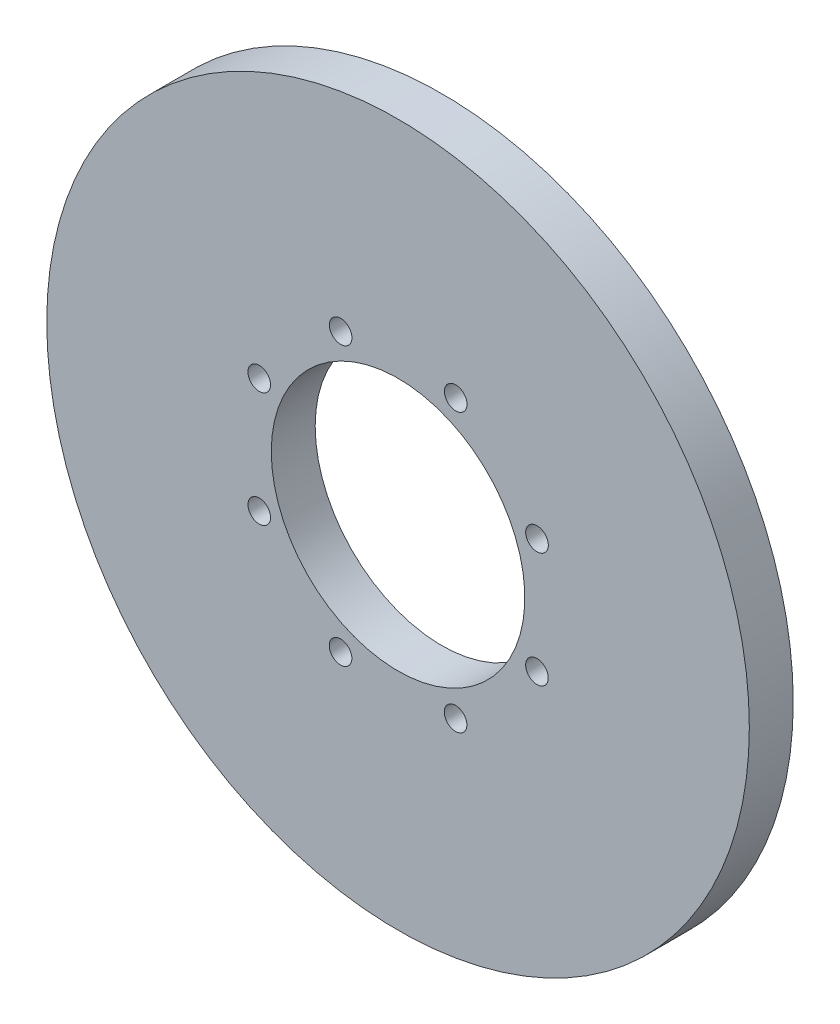
ISO-10303-21;
HEADER;
FILE_DESCRIPTION(('STEP AP214'),'2;1');
FILE_NAME('part.step','',(''),(''),'','','');
FILE_SCHEMA(('AUTOMOTIVE_DESIGN { 1 0 10303 214 1 1 1 1 }'));
ENDSEC;
DATA;
#1=APPLICATION_CONTEXT('core data for automotive mechanical design processes');
#2=APPLICATION_PROTOCOL_DEFINITION('international standard','automotive_design',2000,#1);
#3=PRODUCT_CONTEXT('',#1,'mechanical');
#4=PRODUCT('Part','Part','',(#3));
#5=PRODUCT_RELATED_PRODUCT_CATEGORY('part','',(#4));
#6=PRODUCT_DEFINITION_FORMATION('','',#4);
#7=PRODUCT_DEFINITION_CONTEXT('part definition',#1,'design');
#8=PRODUCT_DEFINITION('design','',#6,#7);
#9=PRODUCT_DEFINITION_SHAPE('','',#8);
#10=(LENGTH_UNIT() NAMED_UNIT(*) SI_UNIT(.MILLI.,.METRE.));
#11=(NAMED_UNIT(*) PLANE_ANGLE_UNIT() SI_UNIT($,.RADIAN.));
#12=(NAMED_UNIT(*) SI_UNIT($,.STERADIAN.) SOLID_ANGLE_UNIT());
#13=UNCERTAINTY_MEASURE_WITH_UNIT(LENGTH_MEASURE(1.E-05),#10,'distance_accuracy_value','');
#14=(GEOMETRIC_REPRESENTATION_CONTEXT(3) GLOBAL_UNCERTAINTY_ASSIGNED_CONTEXT((#13)) GLOBAL_UNIT_ASSIGNED_CONTEXT((#10,
#11,#12)) REPRESENTATION_CONTEXT('',''));
#15=CARTESIAN_POINT('',(0.,0.,0.));
#16=DIRECTION('',(0.,0.,1.));
#17=DIRECTION('',(1.,0.,0.));
#18=AXIS2_PLACEMENT_3D('',#15,#16,#17);
#19=CARTESIAN_POINT('',(0.,0.,19.05));
#20=DIRECTION('',(0.,0.,-1.));
#21=DIRECTION('',(-1.,0.,0.));
#22=AXIS2_PLACEMENT_3D('',#19,#20,#21);
#23=CYLINDRICAL_SURFACE('',#22,152.4);
#24=CARTESIAN_POINT('',(0.,0.,19.05));
#25=DIRECTION('',(0.,0.,1.));
#26=DIRECTION('',(1.,0.,0.));
#27=AXIS2_PLACEMENT_3D('',#24,#25,#26);
#28=CIRCLE('',#27,152.4);
#29=CARTESIAN_POINT('',(-152.4,0.,19.05));
#30=VERTEX_POINT('',#29);
#31=EDGE_CURVE('E10',#30,#30,#28,.T.);
#32=CARTESIAN_POINT('',(0.,0.,0.));
#33=DIRECTION('',(0.,0.,1.));
#34=DIRECTION('',(1.,0.,0.));
#35=AXIS2_PLACEMENT_3D('',#32,#33,#34);
#36=CIRCLE('',#35,152.4);
#37=CARTESIAN_POINT('',(-152.4,0.,0.));
#38=VERTEX_POINT('',#37);
#39=EDGE_CURVE('E34',#38,#38,#36,.T.);
#40=CARTESIAN_POINT('',(-152.4,0.,19.05));
#41=CARTESIAN_POINT('',(-152.4,0.,18.8515625));
#42=CARTESIAN_POINT('',(-152.4,0.,18.653125));
#43=CARTESIAN_POINT('',(-152.4,0.,18.25625));
#44=CARTESIAN_POINT('',(-152.4,0.,18.0578125));
#45=CARTESIAN_POINT('',(-152.4,0.,17.6609375));
#46=CARTESIAN_POINT('',(-152.4,0.,17.4625));
#47=CARTESIAN_POINT('',(-152.4,0.,17.065625));
#48=CARTESIAN_POINT('',(-152.4,0.,16.8671875));
#49=CARTESIAN_POINT('',(-152.4,0.,16.4703125));
#50=CARTESIAN_POINT('',(-152.4,0.,16.271875));
#51=CARTESIAN_POINT('',(-152.4,0.,15.875));
#52=CARTESIAN_POINT('',(-152.4,0.,15.6765625));
#53=CARTESIAN_POINT('',(-152.4,0.,15.2796875));
#54=CARTESIAN_POINT('',(-152.4,0.,15.08125));
#55=CARTESIAN_POINT('',(-152.4,0.,14.684375));
#56=CARTESIAN_POINT('',(-152.4,0.,14.4859375));
#57=CARTESIAN_POINT('',(-152.4,0.,14.0890625));
#58=CARTESIAN_POINT('',(-152.4,0.,13.890625));
#59=CARTESIAN_POINT('',(-152.4,0.,13.49375));
#60=CARTESIAN_POINT('',(-152.4,0.,13.2953125));
#61=CARTESIAN_POINT('',(-152.4,0.,12.8984375));
#62=CARTESIAN_POINT('',(-152.4,0.,12.7));
#63=CARTESIAN_POINT('',(-152.4,0.,12.303125));
#64=CARTESIAN_POINT('',(-152.4,0.,12.1046875));
#65=CARTESIAN_POINT('',(-152.4,0.,11.7078125));
#66=CARTESIAN_POINT('',(-152.4,0.,11.509375));
#67=CARTESIAN_POINT('',(-152.4,0.,11.1125));
#68=CARTESIAN_POINT('',(-152.4,0.,10.9140625));
#69=CARTESIAN_POINT('',(-152.4,0.,10.5171875));
#70=CARTESIAN_POINT('',(-152.4,0.,10.31875));
#71=CARTESIAN_POINT('',(-152.4,0.,9.921875));
#72=CARTESIAN_POINT('',(-152.4,0.,9.7234375));
#73=CARTESIAN_POINT('',(-152.4,0.,9.3265625));
#74=CARTESIAN_POINT('',(-152.4,0.,9.128125));
#75=CARTESIAN_POINT('',(-152.4,0.,8.73125));
#76=CARTESIAN_POINT('',(-152.4,0.,8.5328125));
#77=CARTESIAN_POINT('',(-152.4,0.,8.1359375));
#78=CARTESIAN_POINT('',(-152.4,0.,7.9375));
#79=CARTESIAN_POINT('',(-152.4,0.,7.540625));
#80=CARTESIAN_POINT('',(-152.4,0.,7.3421875));
#81=CARTESIAN_POINT('',(-152.4,0.,6.9453125));
#82=CARTESIAN_POINT('',(-152.4,0.,6.746875));
#83=CARTESIAN_POINT('',(-152.4,0.,6.35));
#84=CARTESIAN_POINT('',(-152.4,0.,6.1515625));
#85=CARTESIAN_POINT('',(-152.4,0.,5.7546875));
#86=CARTESIAN_POINT('',(-152.4,0.,5.55625));
#87=CARTESIAN_POINT('',(-152.4,0.,5.159375));
#88=CARTESIAN_POINT('',(-152.4,0.,4.9609375));
#89=CARTESIAN_POINT('',(-152.4,0.,4.5640625));
#90=CARTESIAN_POINT('',(-152.4,0.,4.365625));
#91=CARTESIAN_POINT('',(-152.4,0.,3.96875));
#92=CARTESIAN_POINT('',(-152.4,0.,3.7703125));
#93=CARTESIAN_POINT('',(-152.4,0.,3.3734375));
#94=CARTESIAN_POINT('',(-152.4,0.,3.175));
#95=CARTESIAN_POINT('',(-152.4,0.,2.778125));
#96=CARTESIAN_POINT('',(-152.4,0.,2.5796875));
#97=CARTESIAN_POINT('',(-152.4,0.,2.1828125));
#98=CARTESIAN_POINT('',(-152.4,0.,1.984375));
#99=CARTESIAN_POINT('',(-152.4,0.,1.5875));
#100=CARTESIAN_POINT('',(-152.4,0.,1.3890625));
#101=CARTESIAN_POINT('',(-152.4,0.,0.992187500000001));
#102=CARTESIAN_POINT('',(-152.4,0.,0.793750000000001));
#103=CARTESIAN_POINT('',(-152.4,0.,0.396875));
#104=CARTESIAN_POINT('',(-152.4,0.,0.1984375));
#105=CARTESIAN_POINT('',(-152.4,0.,0.));
#106=B_SPLINE_CURVE_WITH_KNOTS('',3,(#40,#41,#42,#43,#44,#45,#46,#47,#48,#49,#50,#51,#52,#53,
#54,#55,#56,#57,#58,#59,#60,#61,#62,#63,#64,#65,#66,#67,#68,#69,#70,#71,#72,#73,#74,#75,#76,#77,
#78,#79,#80,#81,#82,#83,#84,#85,#86,#87,#88,#89,#90,#91,#92,#93,#94,#95,#96,#97,#98,#99,#100,
#101,#102,#103,#104,#105),.UNSPECIFIED.,.F.,.F.,(4,2,2,2,2,2,2,2,2,2,2,2,2,2,2,2,2,2,2,2,2,2,2,
2,2,2,2,2,2,2,2,2,4),(0.,0.5953125,1.190625,1.7859375,2.38125,2.9765625,3.571875,4.1671875,
4.7625,5.3578125,5.953125,6.5484375,7.14375,7.7390625,8.334375,8.9296875,9.525,10.1203125,
10.715625,11.3109375,11.90625,12.5015625,13.096875,13.6921875,14.2875,14.8828125,15.478125,
16.0734375,16.66875,17.2640625,17.859375,18.4546875,19.05),.UNSPECIFIED.);
#107=EDGE_CURVE('BSEAM31',#30,#38,#106,.T.);
#108=ORIENTED_EDGE('',*,*,#31,.F.);
#109=ORIENTED_EDGE('',*,*,#39,.T.);
#110=ORIENTED_EDGE('',*,*,#107,.T.);
#111=ORIENTED_EDGE('',*,*,#107,.F.);
#112=EDGE_LOOP('',(#108,#110,#109,#111));
#113=FACE_BOUND('',#112,.T.);
#114=ADVANCED_FACE('F31',(#113),#23,.T.);
#115=CARTESIAN_POINT('',(0.,0.,19.05));
#116=DIRECTION('',(0.,0.,1.));
#117=DIRECTION('',(1.,0.,0.));
#118=AXIS2_PLACEMENT_3D('',#115,#116,#117);
#119=PLANE('',#118);
#120=CARTESIAN_POINT('',(60.2851091676505,24.8616996892165,19.05));
#121=DIRECTION('',(0.,0.,1.));
#122=DIRECTION('',(1.,0.,0.));
#123=AXIS2_PLACEMENT_3D('',#120,#121,#122);
#124=CIRCLE('',#123,4.90219999999999);
#125=CARTESIAN_POINT('',(65.1873091676505,24.8616996892165,19.05));
#126=VERTEX_POINT('',#125);
#127=EDGE_CURVE('E93',#126,#126,#124,.T.);
#128=ORIENTED_EDGE('',*,*,#127,.F.);
#129=EDGE_LOOP('',(#128));
#130=FACE_BOUND('',#129,.T.);
#131=CARTESIAN_POINT('',(60.2622707226686,-25.0404193448468,19.05));
#132=DIRECTION('',(0.,0.,1.));
#133=DIRECTION('',(1.,0.,0.));
#134=AXIS2_PLACEMENT_3D('',#131,#132,#133);
#135=CIRCLE('',#134,4.90219999999999);
#136=CARTESIAN_POINT('',(65.1644707226686,-25.0404193448468,19.05));
#137=VERTEX_POINT('',#136);
#138=EDGE_CURVE('E87',#137,#137,#135,.T.);
#139=ORIENTED_EDGE('',*,*,#138,.F.);
#140=EDGE_LOOP('',(#139));
#141=FACE_BOUND('',#140,.T.);
#142=CARTESIAN_POINT('',(-24.9421243194345,-60.2875584692456,19.05));
#143=DIRECTION('',(0.,0.,1.));
#144=DIRECTION('',(1.,0.,0.));
#145=AXIS2_PLACEMENT_3D('',#142,#143,#144);
#146=CIRCLE('',#145,4.90219999999999);
#147=CARTESIAN_POINT('',(-20.0399243194345,-60.2875584692456,19.05));
#148=VERTEX_POINT('',#147);
#149=EDGE_CURVE('E81',#148,#148,#146,.T.);
#150=ORIENTED_EDGE('',*,*,#149,.F.);
#151=EDGE_LOOP('',(#150));
#152=FACE_BOUND('',#151,.T.);
#153=CARTESIAN_POINT('',(-60.2121018841054,-24.9852824725907,19.05));
#154=DIRECTION('',(0.,0.,1.));
#155=DIRECTION('',(1.,0.,0.));
#156=AXIS2_PLACEMENT_3D('',#153,#154,#155);
#157=CIRCLE('',#156,4.90219999999999);
#158=CARTESIAN_POINT('',(-55.3099018841054,-24.9852824725907,19.05));
#159=VERTEX_POINT('',#158);
#160=EDGE_CURVE('E75',#159,#159,#157,.T.);
#161=ORIENTED_EDGE('',*,*,#160,.F.);
#162=EDGE_LOOP('',(#161));
#163=FACE_BOUND('',#162,.T.);
#164=CARTESIAN_POINT('',(24.9599947354461,-60.3103969028547,19.05));
#165=DIRECTION('',(0.,0.,1.));
#166=DIRECTION('',(1.,0.,0.));
#167=AXIS2_PLACEMENT_3D('',#164,#165,#166);
#168=CIRCLE('',#167,4.90219999999999);
#169=CARTESIAN_POINT('',(29.862194735446,-60.3103969028547,19.05));
#170=VERTEX_POINT('',#169);
#171=EDGE_CURVE('E69',#170,#170,#168,.T.);
#172=ORIENTED_EDGE('',*,*,#171,.F.);
#173=EDGE_LOOP('',(#172));
#174=FACE_BOUND('',#173,.T.);
#175=CARTESIAN_POINT('',(-60.2121018841054,24.8616996892165,19.05));
#176=DIRECTION('',(0.,0.,1.));
#177=DIRECTION('',(1.,0.,0.));
#178=AXIS2_PLACEMENT_3D('',#175,#176,#177);
#179=CIRCLE('',#178,4.90219999999999);
#180=CARTESIAN_POINT('',(-55.3099018841054,24.8616996892165,19.05));
#181=VERTEX_POINT('',#180);
#182=EDGE_CURVE('E63',#181,#181,#179,.T.);
#183=ORIENTED_EDGE('',*,*,#182,.F.);
#184=EDGE_LOOP('',(#183));
#185=FACE_BOUND('',#184,.T.);
#186=CARTESIAN_POINT('',(-24.8869874197,60.1868141328012,19.05));
#187=DIRECTION('',(0.,0.,1.));
#188=DIRECTION('',(1.,0.,0.));
#189=AXIS2_PLACEMENT_3D('',#186,#187,#188);
#190=CIRCLE('',#189,4.90219999999999);
#191=CARTESIAN_POINT('',(-19.9847874197,60.1868141328012,19.05));
#192=VERTEX_POINT('',#191);
#193=EDGE_CURVE('E57',#192,#192,#190,.T.);
#194=ORIENTED_EDGE('',*,*,#193,.F.);
#195=EDGE_LOOP('',(#194));
#196=FACE_BOUND('',#195,.T.);
#197=CARTESIAN_POINT('',(25.0151316257406,60.1639756764312,19.05));
#198=DIRECTION('',(0.,0.,1.));
#199=DIRECTION('',(1.,0.,0.));
#200=AXIS2_PLACEMENT_3D('',#197,#198,#199);
#201=CIRCLE('',#200,4.90219999999999);
#202=CARTESIAN_POINT('',(29.9173316257406,60.1639756764312,19.05));
#203=VERTEX_POINT('',#202);
#204=EDGE_CURVE('E51',#203,#203,#201,.T.);
#205=ORIENTED_EDGE('',*,*,#204,.F.);
#206=EDGE_LOOP('',(#205));
#207=FACE_BOUND('',#206,.T.);
#208=CARTESIAN_POINT('',(0.,0.,19.05));
#209=DIRECTION('',(0.,0.,-1.));
#210=DIRECTION('',(-1.,0.,0.));
#211=AXIS2_PLACEMENT_3D('',#208,#209,#210);
#212=CIRCLE('',#211,55.);
#213=CARTESIAN_POINT('',(-55.,0.,19.05));
#214=VERTEX_POINT('',#213);
#215=EDGE_CURVE('E41',#214,#214,#212,.T.);
#216=ORIENTED_EDGE('',*,*,#215,.T.);
#217=EDGE_LOOP('',(#216));
#218=FACE_BOUND('',#217,.T.);
#219=ORIENTED_EDGE('',*,*,#31,.T.);
#220=EDGE_LOOP('',(#219));
#221=FACE_BOUND('',#220,.T.);
#222=ADVANCED_FACE('F99',(#130,#141,#152,#163,#174,#185,#196,#207,#218,#221),#119,.T.);
#223=CARTESIAN_POINT('',(0.,0.,0.));
#224=DIRECTION('',(0.,0.,1.));
#225=DIRECTION('',(1.,0.,0.));
#226=AXIS2_PLACEMENT_3D('',#223,#224,#225);
#227=PLANE('',#226);
#228=CARTESIAN_POINT('',(60.2851091676505,24.8616996892165,0.));
#229=DIRECTION('',(0.,0.,1.));
#230=DIRECTION('',(1.,0.,0.));
#231=AXIS2_PLACEMENT_3D('',#228,#229,#230);
#232=CIRCLE('',#231,4.90219999999999);
#233=CARTESIAN_POINT('',(65.1873091676505,24.8616996892165,0.));
#234=VERTEX_POINT('',#233);
#235=EDGE_CURVE('E90',#234,#234,#232,.T.);
#236=ORIENTED_EDGE('',*,*,#235,.T.);
#237=EDGE_LOOP('',(#236));
#238=FACE_BOUND('',#237,.T.);
#239=CARTESIAN_POINT('',(60.2622707226686,-25.0404193448468,0.));
#240=DIRECTION('',(0.,0.,1.));
#241=DIRECTION('',(1.,0.,0.));
#242=AXIS2_PLACEMENT_3D('',#239,#240,#241);
#243=CIRCLE('',#242,4.90219999999999);
#244=CARTESIAN_POINT('',(65.1644707226686,-25.0404193448468,0.));
#245=VERTEX_POINT('',#244);
#246=EDGE_CURVE('E84',#245,#245,#243,.T.);
#247=ORIENTED_EDGE('',*,*,#246,.T.);
#248=EDGE_LOOP('',(#247));
#249=FACE_BOUND('',#248,.T.);
#250=CARTESIAN_POINT('',(-24.9421243194345,-60.2875584692456,0.));
#251=DIRECTION('',(0.,0.,1.));
#252=DIRECTION('',(1.,0.,0.));
#253=AXIS2_PLACEMENT_3D('',#250,#251,#252);
#254=CIRCLE('',#253,4.9022);
#255=CARTESIAN_POINT('',(-20.0399243194345,-60.2875584692456,0.));
#256=VERTEX_POINT('',#255);
#257=EDGE_CURVE('E78',#256,#256,#254,.T.);
#258=ORIENTED_EDGE('',*,*,#257,.T.);
#259=EDGE_LOOP('',(#258));
#260=FACE_BOUND('',#259,.T.);
#261=CARTESIAN_POINT('',(-60.2121018841054,-24.9852824725907,0.));
#262=DIRECTION('',(0.,0.,1.));
#263=DIRECTION('',(1.,0.,0.));
#264=AXIS2_PLACEMENT_3D('',#261,#262,#263);
#265=CIRCLE('',#264,4.9022);
#266=CARTESIAN_POINT('',(-55.3099018841054,-24.9852824725907,0.));
#267=VERTEX_POINT('',#266);
#268=EDGE_CURVE('E72',#267,#267,#265,.T.);
#269=ORIENTED_EDGE('',*,*,#268,.T.);
#270=EDGE_LOOP('',(#269));
#271=FACE_BOUND('',#270,.T.);
#272=CARTESIAN_POINT('',(24.9599947354461,-60.3103969028547,0.));
#273=DIRECTION('',(0.,0.,1.));
#274=DIRECTION('',(1.,0.,0.));
#275=AXIS2_PLACEMENT_3D('',#272,#273,#274);
#276=CIRCLE('',#275,4.9022);
#277=CARTESIAN_POINT('',(29.8621947354461,-60.3103969028547,0.));
#278=VERTEX_POINT('',#277);
#279=EDGE_CURVE('E66',#278,#278,#276,.T.);
#280=ORIENTED_EDGE('',*,*,#279,.T.);
#281=EDGE_LOOP('',(#280));
#282=FACE_BOUND('',#281,.T.);
#283=CARTESIAN_POINT('',(-60.2121018841054,24.8616996892165,0.));
#284=DIRECTION('',(0.,0.,1.));
#285=DIRECTION('',(1.,0.,0.));
#286=AXIS2_PLACEMENT_3D('',#283,#284,#285);
#287=CIRCLE('',#286,4.9022);
#288=CARTESIAN_POINT('',(-55.3099018841054,24.8616996892165,0.));
#289=VERTEX_POINT('',#288);
#290=EDGE_CURVE('E60',#289,#289,#287,.T.);
#291=ORIENTED_EDGE('',*,*,#290,.T.);
#292=EDGE_LOOP('',(#291));
#293=FACE_BOUND('',#292,.T.);
#294=CARTESIAN_POINT('',(-24.8869874197,60.1868141328012,0.));
#295=DIRECTION('',(0.,0.,1.));
#296=DIRECTION('',(1.,0.,0.));
#297=AXIS2_PLACEMENT_3D('',#294,#295,#296);
#298=CIRCLE('',#297,4.9022);
#299=CARTESIAN_POINT('',(-19.9847874197,60.1868141328012,0.));
#300=VERTEX_POINT('',#299);
#301=EDGE_CURVE('E54',#300,#300,#298,.T.);
#302=ORIENTED_EDGE('',*,*,#301,.T.);
#303=EDGE_LOOP('',(#302));
#304=FACE_BOUND('',#303,.T.);
#305=CARTESIAN_POINT('',(25.0151316257406,60.1639756764312,0.));
#306=DIRECTION('',(0.,0.,1.));
#307=DIRECTION('',(1.,0.,0.));
#308=AXIS2_PLACEMENT_3D('',#305,#306,#307);
#309=CIRCLE('',#308,4.9022);
#310=CARTESIAN_POINT('',(29.9173316257406,60.1639756764312,0.));
#311=VERTEX_POINT('',#310);
#312=EDGE_CURVE('E46',#311,#311,#309,.T.);
#313=ORIENTED_EDGE('',*,*,#312,.T.);
#314=EDGE_LOOP('',(#313));
#315=FACE_BOUND('',#314,.T.);
#316=CARTESIAN_POINT('',(0.,0.,0.));
#317=DIRECTION('',(0.,0.,-1.));
#318=DIRECTION('',(-1.,0.,0.));
#319=AXIS2_PLACEMENT_3D('',#316,#317,#318);
#320=CIRCLE('',#319,55.);
#321=CARTESIAN_POINT('',(-55.,0.,0.));
#322=VERTEX_POINT('',#321);
#323=EDGE_CURVE('E43',#322,#322,#320,.T.);
#324=ORIENTED_EDGE('',*,*,#323,.F.);
#325=EDGE_LOOP('',(#324));
#326=FACE_BOUND('',#325,.T.);
#327=ORIENTED_EDGE('',*,*,#39,.F.);
#328=EDGE_LOOP('',(#327));
#329=FACE_BOUND('',#328,.T.);
#330=ADVANCED_FACE('F102',(#238,#249,#260,#271,#282,#293,#304,#315,#326,#329),#227,.F.);
#331=CARTESIAN_POINT('',(0.,0.,19.05));
#332=DIRECTION('',(0.,0.,-1.));
#333=DIRECTION('',(-1.,0.,0.));
#334=AXIS2_PLACEMENT_3D('',#331,#332,#333);
#335=CYLINDRICAL_SURFACE('',#334,55.);
#336=CARTESIAN_POINT('',(-55.,0.,19.05));
#337=CARTESIAN_POINT('',(-55.,0.,18.8515625));
#338=CARTESIAN_POINT('',(-55.,0.,18.653125));
#339=CARTESIAN_POINT('',(-55.,0.,18.25625));
#340=CARTESIAN_POINT('',(-55.,0.,18.0578125));
#341=CARTESIAN_POINT('',(-55.,0.,17.6609375));
#342=CARTESIAN_POINT('',(-55.,0.,17.4625));
#343=CARTESIAN_POINT('',(-55.,0.,17.065625));
#344=CARTESIAN_POINT('',(-55.,0.,16.8671875));
#345=CARTESIAN_POINT('',(-55.,0.,16.4703125));
#346=CARTESIAN_POINT('',(-55.,0.,16.271875));
#347=CARTESIAN_POINT('',(-55.,0.,15.875));
#348=CARTESIAN_POINT('',(-55.,0.,15.6765625));
#349=CARTESIAN_POINT('',(-55.,0.,15.2796875));
#350=CARTESIAN_POINT('',(-55.,0.,15.08125));
#351=CARTESIAN_POINT('',(-55.,0.,14.684375));
#352=CARTESIAN_POINT('',(-55.,0.,14.4859375));
#353=CARTESIAN_POINT('',(-55.,0.,14.0890625));
#354=CARTESIAN_POINT('',(-55.,0.,13.890625));
#355=CARTESIAN_POINT('',(-55.,0.,13.49375));
#356=CARTESIAN_POINT('',(-55.,0.,13.2953125));
#357=CARTESIAN_POINT('',(-55.,0.,12.8984375));
#358=CARTESIAN_POINT('',(-55.,0.,12.7));
#359=CARTESIAN_POINT('',(-55.,0.,12.303125));
#360=CARTESIAN_POINT('',(-55.,0.,12.1046875));
#361=CARTESIAN_POINT('',(-55.,0.,11.7078125));
#362=CARTESIAN_POINT('',(-55.,0.,11.509375));
#363=CARTESIAN_POINT('',(-55.,0.,11.1125));
#364=CARTESIAN_POINT('',(-55.,0.,10.9140625));
#365=CARTESIAN_POINT('',(-55.,0.,10.5171875));
#366=CARTESIAN_POINT('',(-55.,0.,10.31875));
#367=CARTESIAN_POINT('',(-55.,0.,9.921875));
#368=CARTESIAN_POINT('',(-55.,0.,9.7234375));
#369=CARTESIAN_POINT('',(-55.,0.,9.3265625));
#370=CARTESIAN_POINT('',(-55.,0.,9.128125));
#371=CARTESIAN_POINT('',(-55.,0.,8.73125));
#372=CARTESIAN_POINT('',(-55.,0.,8.5328125));
#373=CARTESIAN_POINT('',(-55.,0.,8.1359375));
#374=CARTESIAN_POINT('',(-55.,0.,7.9375));
#375=CARTESIAN_POINT('',(-55.,0.,7.540625));
#376=CARTESIAN_POINT('',(-55.,0.,7.3421875));
#377=CARTESIAN_POINT('',(-55.,0.,6.9453125));
#378=CARTESIAN_POINT('',(-55.,0.,6.746875));
#379=CARTESIAN_POINT('',(-55.,0.,6.35));
#380=CARTESIAN_POINT('',(-55.,0.,6.1515625));
#381=CARTESIAN_POINT('',(-55.,0.,5.7546875));
#382=CARTESIAN_POINT('',(-55.,0.,5.55625));
#383=CARTESIAN_POINT('',(-55.,0.,5.159375));
#384=CARTESIAN_POINT('',(-55.,0.,4.9609375));
#385=CARTESIAN_POINT('',(-55.,0.,4.5640625));
#386=CARTESIAN_POINT('',(-55.,0.,4.365625));
#387=CARTESIAN_POINT('',(-55.,0.,3.96875));
#388=CARTESIAN_POINT('',(-55.,0.,3.7703125));
#389=CARTESIAN_POINT('',(-55.,0.,3.3734375));
#390=CARTESIAN_POINT('',(-55.,0.,3.175));
#391=CARTESIAN_POINT('',(-55.,0.,2.778125));
#392=CARTESIAN_POINT('',(-55.,0.,2.5796875));
#393=CARTESIAN_POINT('',(-55.,0.,2.1828125));
#394=CARTESIAN_POINT('',(-55.,0.,1.984375));
#395=CARTESIAN_POINT('',(-55.,0.,1.5875));
#396=CARTESIAN_POINT('',(-55.,0.,1.3890625));
#397=CARTESIAN_POINT('',(-55.,0.,0.992187500000001));
#398=CARTESIAN_POINT('',(-55.,0.,0.793750000000001));
#399=CARTESIAN_POINT('',(-55.,0.,0.396875));
#400=CARTESIAN_POINT('',(-55.,0.,0.1984375));
#401=CARTESIAN_POINT('',(-55.,0.,0.));
#402=B_SPLINE_CURVE_WITH_KNOTS('',3,(#336,#337,#338,#339,#340,#341,#342,#343,#344,#345,#346,
#347,#348,#349,#350,#351,#352,#353,#354,#355,#356,#357,#358,#359,#360,#361,#362,#363,#364,#365,
#366,#367,#368,#369,#370,#371,#372,#373,#374,#375,#376,#377,#378,#379,#380,#381,#382,#383,#384,
#385,#386,#387,#388,#389,#390,#391,#392,#393,#394,#395,#396,#397,#398,#399,#400,#401),
.UNSPECIFIED.,.F.,.F.,(4,2,2,2,2,2,2,2,2,2,2,2,2,2,2,2,2,2,2,2,2,2,2,2,2,2,2,2,2,2,2,2,4),(0.,
0.5953125,1.190625,1.7859375,2.38125,2.9765625,3.571875,4.1671875,4.7625,5.3578125,5.953125,
6.5484375,7.14375,7.7390625,8.334375,8.9296875,9.525,10.1203125,10.715625,11.3109375,11.90625,
12.5015625,13.096875,13.6921875,14.2875,14.8828125,15.478125,16.0734375,16.66875,17.2640625,
17.859375,18.4546875,19.05),.UNSPECIFIED.);
#403=EDGE_CURVE('BSEAM120',#214,#322,#402,.T.);
#404=ORIENTED_EDGE('',*,*,#215,.F.);
#405=ORIENTED_EDGE('',*,*,#323,.T.);
#406=ORIENTED_EDGE('',*,*,#403,.T.);
#407=ORIENTED_EDGE('',*,*,#403,.F.);
#408=EDGE_LOOP('',(#404,#406,#405,#407));
#409=FACE_BOUND('',#408,.T.);
#410=ADVANCED_FACE('F120',(#409),#335,.F.);
#411=CARTESIAN_POINT('',(25.0151316257406,60.1639756764312,19.05));
#412=DIRECTION('',(0.,0.,1.));
#413=DIRECTION('',(1.,0.,0.));
#414=AXIS2_PLACEMENT_3D('',#411,#412,#413);
#415=CYLINDRICAL_SURFACE('',#414,4.90219999999999);
#416=ORIENTED_EDGE('',*,*,#312,.F.);
#417=EDGE_LOOP('',(#416));
#418=FACE_BOUND('',#417,.T.);
#419=ORIENTED_EDGE('',*,*,#204,.T.);
#420=EDGE_LOOP('',(#419));
#421=FACE_BOUND('',#420,.T.);
#422=ADVANCED_FACE('F123',(#418,#421),#415,.F.);
#423=CARTESIAN_POINT('',(-24.8869874197,60.1868141328012,19.05));
#424=DIRECTION('',(0.,0.,1.));
#425=DIRECTION('',(1.,0.,0.));
#426=AXIS2_PLACEMENT_3D('',#423,#424,#425);
#427=CYLINDRICAL_SURFACE('',#426,4.90219999999999);
#428=ORIENTED_EDGE('',*,*,#301,.F.);
#429=EDGE_LOOP('',(#428));
#430=FACE_BOUND('',#429,.T.);
#431=ORIENTED_EDGE('',*,*,#193,.T.);
#432=EDGE_LOOP('',(#431));
#433=FACE_BOUND('',#432,.T.);
#434=ADVANCED_FACE('F154',(#430,#433),#427,.F.);
#435=CARTESIAN_POINT('',(-60.2121018841054,24.8616996892165,19.05));
#436=DIRECTION('',(0.,0.,1.));
#437=DIRECTION('',(1.,0.,0.));
#438=AXIS2_PLACEMENT_3D('',#435,#436,#437);
#439=CYLINDRICAL_SURFACE('',#438,4.90219999999999);
#440=ORIENTED_EDGE('',*,*,#290,.F.);
#441=EDGE_LOOP('',(#440));
#442=FACE_BOUND('',#441,.T.);
#443=ORIENTED_EDGE('',*,*,#182,.T.);
#444=EDGE_LOOP('',(#443));
#445=FACE_BOUND('',#444,.T.);
#446=ADVANCED_FACE('F162',(#442,#445),#439,.F.);
#447=CARTESIAN_POINT('',(24.9599947354461,-60.3103969028547,19.05));
#448=DIRECTION('',(0.,0.,1.));
#449=DIRECTION('',(1.,0.,0.));
#450=AXIS2_PLACEMENT_3D('',#447,#448,#449);
#451=CYLINDRICAL_SURFACE('',#450,4.90219999999999);
#452=ORIENTED_EDGE('',*,*,#279,.F.);
#453=EDGE_LOOP('',(#452));
#454=FACE_BOUND('',#453,.T.);
#455=ORIENTED_EDGE('',*,*,#171,.T.);
#456=EDGE_LOOP('',(#455));
#457=FACE_BOUND('',#456,.T.);
#458=ADVANCED_FACE('F170',(#454,#457),#451,.F.);
#459=CARTESIAN_POINT('',(-60.2121018841054,-24.9852824725907,19.05));
#460=DIRECTION('',(0.,0.,1.));
#461=DIRECTION('',(1.,0.,0.));
#462=AXIS2_PLACEMENT_3D('',#459,#460,#461);
#463=CYLINDRICAL_SURFACE('',#462,4.90219999999999);
#464=ORIENTED_EDGE('',*,*,#268,.F.);
#465=EDGE_LOOP('',(#464));
#466=FACE_BOUND('',#465,.T.);
#467=ORIENTED_EDGE('',*,*,#160,.T.);
#468=EDGE_LOOP('',(#467));
#469=FACE_BOUND('',#468,.T.);
#470=ADVANCED_FACE('F178',(#466,#469),#463,.F.);
#471=CARTESIAN_POINT('',(-24.9421243194345,-60.2875584692456,19.05));
#472=DIRECTION('',(0.,0.,1.));
#473=DIRECTION('',(1.,0.,0.));
#474=AXIS2_PLACEMENT_3D('',#471,#472,#473);
#475=CYLINDRICAL_SURFACE('',#474,4.90219999999999);
#476=ORIENTED_EDGE('',*,*,#257,.F.);
#477=EDGE_LOOP('',(#476));
#478=FACE_BOUND('',#477,.T.);
#479=ORIENTED_EDGE('',*,*,#149,.T.);
#480=EDGE_LOOP('',(#479));
#481=FACE_BOUND('',#480,.T.);
#482=ADVANCED_FACE('F186',(#478,#481),#475,.F.);
#483=CARTESIAN_POINT('',(60.2622707226686,-25.0404193448468,19.05));
#484=DIRECTION('',(0.,0.,1.));
#485=DIRECTION('',(1.,0.,0.));
#486=AXIS2_PLACEMENT_3D('',#483,#484,#485);
#487=CYLINDRICAL_SURFACE('',#486,4.90219999999999);
#488=ORIENTED_EDGE('',*,*,#246,.F.);
#489=EDGE_LOOP('',(#488));
#490=FACE_BOUND('',#489,.T.);
#491=ORIENTED_EDGE('',*,*,#138,.T.);
#492=EDGE_LOOP('',(#491));
#493=FACE_BOUND('',#492,.T.);
#494=ADVANCED_FACE('F194',(#490,#493),#487,.F.);
#495=CARTESIAN_POINT('',(60.2851091676505,24.8616996892165,19.05));
#496=DIRECTION('',(0.,0.,1.));
#497=DIRECTION('',(1.,0.,0.));
#498=AXIS2_PLACEMENT_3D('',#495,#496,#497);
#499=CYLINDRICAL_SURFACE('',#498,4.90219999999999);
#500=ORIENTED_EDGE('',*,*,#235,.F.);
#501=EDGE_LOOP('',(#500));
#502=FACE_BOUND('',#501,.T.);
#503=ORIENTED_EDGE('',*,*,#127,.T.);
#504=EDGE_LOOP('',(#503));
#505=FACE_BOUND('',#504,.T.);
#506=ADVANCED_FACE('F97',(#502,#505),#499,.F.);
#507=CLOSED_SHELL('',(#114,#222,#330,#410,#422,#434,#446,#458,#470,#482,#494,#506));
#508=MANIFOLD_SOLID_BREP('B2',#507);
#509=ADVANCED_BREP_SHAPE_REPRESENTATION('',(#18,#508),#14);
#510=SHAPE_DEFINITION_REPRESENTATION(#9,#509);
ENDSEC;
END-ISO-10303-21;
